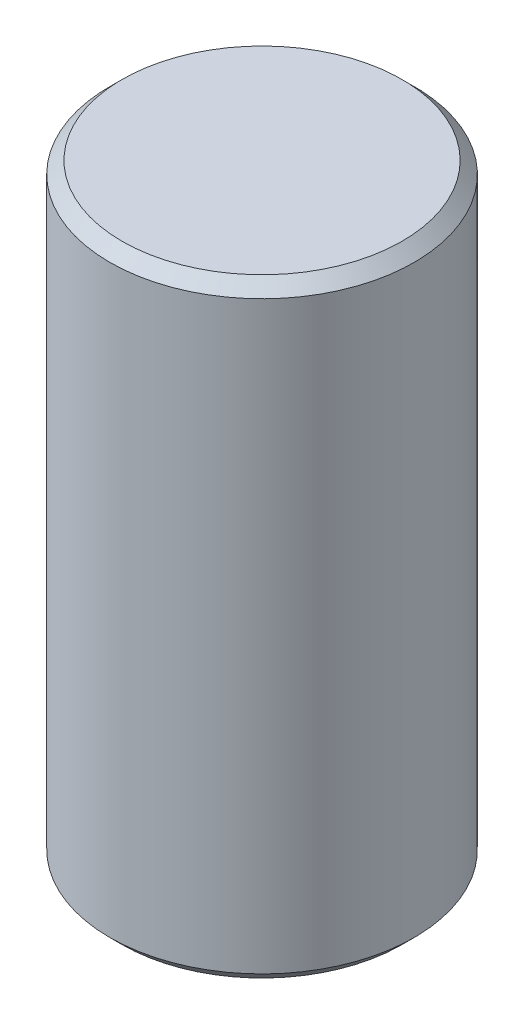
ISO-10303-21;
HEADER;
FILE_DESCRIPTION(('STEP AP214'),'2;1');
FILE_NAME('part.step','',(''),(''),'','','');
FILE_SCHEMA(('AUTOMOTIVE_DESIGN { 1 0 10303 214 1 1 1 1 }'));
ENDSEC;
DATA;
#1=APPLICATION_CONTEXT('core data for automotive mechanical design processes');
#2=APPLICATION_PROTOCOL_DEFINITION('international standard','automotive_design',2000,#1);
#3=PRODUCT_CONTEXT('',#1,'mechanical');
#4=PRODUCT('Part','Part','',(#3));
#5=PRODUCT_RELATED_PRODUCT_CATEGORY('part','',(#4));
#6=PRODUCT_DEFINITION_FORMATION('','',#4);
#7=PRODUCT_DEFINITION_CONTEXT('part definition',#1,'design');
#8=PRODUCT_DEFINITION('design','',#6,#7);
#9=PRODUCT_DEFINITION_SHAPE('','',#8);
#10=(LENGTH_UNIT() NAMED_UNIT(*) SI_UNIT(.MILLI.,.METRE.));
#11=(NAMED_UNIT(*) PLANE_ANGLE_UNIT() SI_UNIT($,.RADIAN.));
#12=(NAMED_UNIT(*) SI_UNIT($,.STERADIAN.) SOLID_ANGLE_UNIT());
#13=UNCERTAINTY_MEASURE_WITH_UNIT(LENGTH_MEASURE(1.E-05),#10,'distance_accuracy_value','');
#14=(GEOMETRIC_REPRESENTATION_CONTEXT(3) GLOBAL_UNCERTAINTY_ASSIGNED_CONTEXT((#13)) GLOBAL_UNIT_ASSIGNED_CONTEXT((#10,
#11,#12)) REPRESENTATION_CONTEXT('',''));
#15=CARTESIAN_POINT('',(0.,0.,0.));
#16=DIRECTION('',(0.,0.,1.));
#17=DIRECTION('',(1.,0.,0.));
#18=AXIS2_PLACEMENT_3D('',#15,#16,#17);
#19=CARTESIAN_POINT('',(0.,2.5,0.));
#20=DIRECTION('',(0.,-1.,0.));
#21=DIRECTION('',(0.,0.,-1.));
#22=AXIS2_PLACEMENT_3D('',#19,#20,#21);
#23=CYLINDRICAL_SURFACE('',#22,1.25);
#24=CARTESIAN_POINT('',(0.,-2.4,0.));
#25=DIRECTION('',(0.,1.,0.));
#26=DIRECTION('',(0.,0.,1.));
#27=AXIS2_PLACEMENT_3D('',#24,#25,#26);
#28=CIRCLE('',#27,1.25);
#29=CARTESIAN_POINT('',(0.,-2.4,1.25));
#30=VERTEX_POINT('',#29);
#31=EDGE_CURVE('E45',#30,#30,#28,.T.);
#32=ORIENTED_EDGE('',*,*,#31,.T.);
#33=EDGE_LOOP('',(#32));
#34=FACE_BOUND('',#33,.T.);
#35=CARTESIAN_POINT('',(0.,2.4,0.));
#36=DIRECTION('',(0.,1.,0.));
#37=DIRECTION('',(0.,0.,1.));
#38=AXIS2_PLACEMENT_3D('',#35,#36,#37);
#39=CIRCLE('',#38,1.25);
#40=CARTESIAN_POINT('',(0.,2.4,1.25));
#41=VERTEX_POINT('',#40);
#42=EDGE_CURVE('E49',#41,#41,#39,.F.);
#43=ORIENTED_EDGE('',*,*,#42,.T.);
#44=EDGE_LOOP('',(#43));
#45=FACE_BOUND('',#44,.T.);
#46=ADVANCED_FACE('F33',(#34,#45),#23,.T.);
#47=CARTESIAN_POINT('',(0.,2.5,0.));
#48=DIRECTION('',(0.,1.,0.));
#49=DIRECTION('',(0.,0.,1.));
#50=AXIS2_PLACEMENT_3D('',#47,#48,#49);
#51=PLANE('',#50);
#52=CARTESIAN_POINT('',(0.,2.5,0.));
#53=DIRECTION('',(0.,1.,0.));
#54=DIRECTION('',(0.,0.,1.));
#55=AXIS2_PLACEMENT_3D('',#52,#53,#54);
#56=CIRCLE('',#55,1.15);
#57=CARTESIAN_POINT('',(0.,2.5,1.15));
#58=VERTEX_POINT('',#57);
#59=EDGE_CURVE('E10',#58,#58,#56,.T.);
#60=ORIENTED_EDGE('',*,*,#59,.T.);
#61=EDGE_LOOP('',(#60));
#62=FACE_BOUND('',#61,.T.);
#63=ADVANCED_FACE('F65',(#62),#51,.T.);
#64=CARTESIAN_POINT('',(0.,-2.5,0.));
#65=DIRECTION('',(0.,1.,0.));
#66=DIRECTION('',(0.,0.,1.));
#67=AXIS2_PLACEMENT_3D('',#64,#65,#66);
#68=PLANE('',#67);
#69=CARTESIAN_POINT('',(0.,-2.5,0.));
#70=DIRECTION('',(0.,1.,0.));
#71=DIRECTION('',(0.,0.,1.));
#72=AXIS2_PLACEMENT_3D('',#69,#70,#71);
#73=CIRCLE('',#72,1.15);
#74=CARTESIAN_POINT('',(0.,-2.5,1.15));
#75=VERTEX_POINT('',#74);
#76=EDGE_CURVE('E41',#75,#75,#73,.F.);
#77=ORIENTED_EDGE('',*,*,#76,.T.);
#78=EDGE_LOOP('',(#77));
#79=FACE_BOUND('',#78,.T.);
#80=ADVANCED_FACE('F62',(#79),#68,.F.);
#81=CARTESIAN_POINT('',(0.,-2.4,0.));
#82=DIRECTION('',(0.,1.,0.));
#83=DIRECTION('',(0.,0.,1.));
#84=AXIS2_PLACEMENT_3D('',#81,#82,#83);
#85=CONICAL_SURFACE('',#84,1.25,0.785398163397456);
#86=ORIENTED_EDGE('',*,*,#76,.F.);
#87=EDGE_LOOP('',(#86));
#88=FACE_BOUND('',#87,.T.);
#89=ORIENTED_EDGE('',*,*,#31,.F.);
#90=EDGE_LOOP('',(#89));
#91=FACE_BOUND('',#90,.T.);
#92=ADVANCED_FACE('F58',(#88,#91),#85,.T.);
#93=CARTESIAN_POINT('',(0.,2.5,0.));
#94=DIRECTION('',(0.,-1.,0.));
#95=DIRECTION('',(0.,0.,-1.));
#96=AXIS2_PLACEMENT_3D('',#93,#94,#95);
#97=CONICAL_SURFACE('',#96,1.15,0.785398163397449);
#98=ORIENTED_EDGE('',*,*,#42,.F.);
#99=EDGE_LOOP('',(#98));
#100=FACE_BOUND('',#99,.T.);
#101=ORIENTED_EDGE('',*,*,#59,.F.);
#102=EDGE_LOOP('',(#101));
#103=FACE_BOUND('',#102,.T.);
#104=ADVANCED_FACE('F36',(#100,#103),#97,.T.);
#105=CLOSED_SHELL('',(#46,#63,#80,#92,#104));
#106=MANIFOLD_SOLID_BREP('B2',#105);
#107=ADVANCED_BREP_SHAPE_REPRESENTATION('',(#18,#106),#14);
#108=SHAPE_DEFINITION_REPRESENTATION(#9,#107);
ENDSEC;
END-ISO-10303-21;
